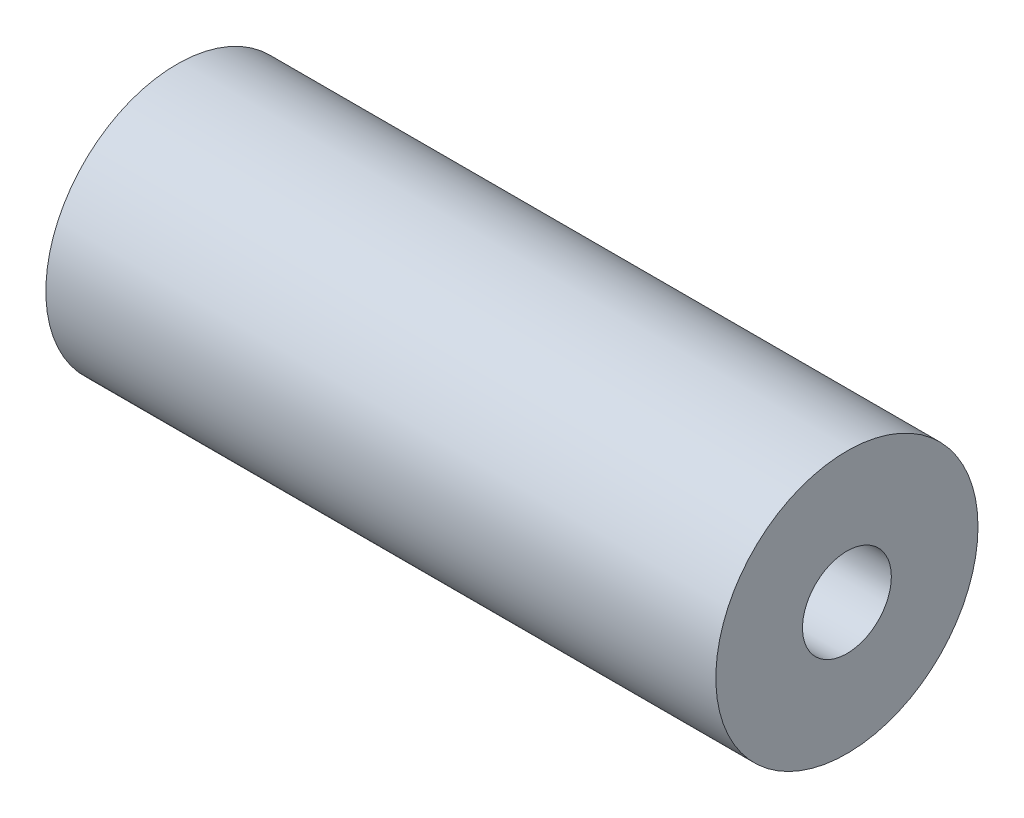
ISO-10303-21;
HEADER;
FILE_DESCRIPTION(('STEP AP214'),'2;1');
FILE_NAME('part.step','',(''),(''),'','','');
FILE_SCHEMA(('AUTOMOTIVE_DESIGN { 1 0 10303 214 1 1 1 1 }'));
ENDSEC;
DATA;
#1=APPLICATION_CONTEXT('core data for automotive mechanical design processes');
#2=APPLICATION_PROTOCOL_DEFINITION('international standard','automotive_design',2000,#1);
#3=PRODUCT_CONTEXT('',#1,'mechanical');
#4=PRODUCT('Part','Part','',(#3));
#5=PRODUCT_RELATED_PRODUCT_CATEGORY('part','',(#4));
#6=PRODUCT_DEFINITION_FORMATION('','',#4);
#7=PRODUCT_DEFINITION_CONTEXT('part definition',#1,'design');
#8=PRODUCT_DEFINITION('design','',#6,#7);
#9=PRODUCT_DEFINITION_SHAPE('','',#8);
#10=(LENGTH_UNIT() NAMED_UNIT(*) SI_UNIT(.MILLI.,.METRE.));
#11=(NAMED_UNIT(*) PLANE_ANGLE_UNIT() SI_UNIT($,.RADIAN.));
#12=(NAMED_UNIT(*) SI_UNIT($,.STERADIAN.) SOLID_ANGLE_UNIT());
#13=UNCERTAINTY_MEASURE_WITH_UNIT(LENGTH_MEASURE(1.E-05),#10,'distance_accuracy_value','');
#14=(GEOMETRIC_REPRESENTATION_CONTEXT(3) GLOBAL_UNCERTAINTY_ASSIGNED_CONTEXT((#13)) GLOBAL_UNIT_ASSIGNED_CONTEXT((#10,
#11,#12)) REPRESENTATION_CONTEXT('',''));
#15=CARTESIAN_POINT('',(0.,0.,0.));
#16=DIRECTION('',(0.,0.,1.));
#17=DIRECTION('',(1.,0.,0.));
#18=AXIS2_PLACEMENT_3D('',#15,#16,#17);
#19=CARTESIAN_POINT('',(14.,0.,0.));
#20=DIRECTION('',(-1.,0.,0.));
#21=DIRECTION('',(0.,0.,1.));
#22=AXIS2_PLACEMENT_3D('',#19,#20,#21);
#23=CYLINDRICAL_SURFACE('',#22,3.);
#24=CARTESIAN_POINT('',(0.,0.,0.));
#25=DIRECTION('',(1.,0.,0.));
#26=DIRECTION('',(0.,0.,-1.));
#27=AXIS2_PLACEMENT_3D('',#24,#25,#26);
#28=CIRCLE('',#27,3.);
#29=CARTESIAN_POINT('',(0.,-1.6583123951777,2.5));
#30=VERTEX_POINT('',#29);
#31=CARTESIAN_POINT('',(0.,1.6583123951777,2.5));
#32=VERTEX_POINT('',#31);
#33=EDGE_CURVE('E91',#30,#32,#28,.T.);
#34=ORIENTED_EDGE('',*,*,#33,.F.);
#35=DIRECTION('',(-1.,0.,0.));
#36=VECTOR('',#35,1.);
#37=CARTESIAN_POINT('',(14.,-1.6583123951777,2.5));
#38=LINE('',#37,#36);
#39=CARTESIAN_POINT('',(14.,-1.6583123951777,2.5));
#40=VERTEX_POINT('',#39);
#41=EDGE_CURVE('E56',#40,#30,#38,.T.);
#42=ORIENTED_EDGE('',*,*,#41,.F.);
#43=CARTESIAN_POINT('',(14.,0.,0.));
#44=DIRECTION('',(1.,0.,0.));
#45=DIRECTION('',(0.,0.,-1.));
#46=AXIS2_PLACEMENT_3D('',#43,#44,#45);
#47=CIRCLE('',#46,3.);
#48=CARTESIAN_POINT('',(14.,1.6583123951777,2.5));
#49=VERTEX_POINT('',#48);
#50=EDGE_CURVE('E72',#40,#49,#47,.T.);
#51=ORIENTED_EDGE('',*,*,#50,.T.);
#52=DIRECTION('',(-1.,0.,0.));
#53=VECTOR('',#52,1.);
#54=CARTESIAN_POINT('',(14.,1.6583123951777,2.5));
#55=LINE('',#54,#53);
#56=EDGE_CURVE('E74',#49,#32,#55,.T.);
#57=ORIENTED_EDGE('',*,*,#56,.T.);
#58=EDGE_LOOP('',(#34,#42,#51,#57));
#59=FACE_BOUND('',#58,.T.);
#60=ADVANCED_FACE('F47',(#59),#23,.F.);
#61=CARTESIAN_POINT('',(14.,0.,2.5));
#62=DIRECTION('',(0.,0.,1.));
#63=DIRECTION('',(1.,0.,0.));
#64=AXIS2_PLACEMENT_3D('',#61,#62,#63);
#65=PLANE('',#64);
#66=DIRECTION('',(0.,1.,0.));
#67=VECTOR('',#66,1.);
#68=CARTESIAN_POINT('',(0.,0.,2.5));
#69=LINE('',#68,#67);
#70=EDGE_CURVE('E82',#30,#32,#69,.T.);
#71=ORIENTED_EDGE('',*,*,#70,.T.);
#72=ORIENTED_EDGE('',*,*,#56,.F.);
#73=DIRECTION('',(0.,1.,0.));
#74=VECTOR('',#73,1.);
#75=CARTESIAN_POINT('',(14.,0.,2.5));
#76=LINE('',#75,#74);
#77=EDGE_CURVE('E78',#40,#49,#76,.T.);
#78=ORIENTED_EDGE('',*,*,#77,.F.);
#79=ORIENTED_EDGE('',*,*,#41,.T.);
#80=EDGE_LOOP('',(#71,#72,#78,#79));
#81=FACE_BOUND('',#80,.T.);
#82=ADVANCED_FACE('F81',(#81),#65,.F.);
#83=CARTESIAN_POINT('',(14.,0.,0.));
#84=DIRECTION('',(-1.,0.,0.));
#85=DIRECTION('',(0.,0.,1.));
#86=AXIS2_PLACEMENT_3D('',#83,#84,#85);
#87=CYLINDRICAL_SURFACE('',#86,4.5);
#88=CARTESIAN_POINT('',(0.,0.,0.));
#89=DIRECTION('',(1.,0.,0.));
#90=DIRECTION('',(0.,0.,-1.));
#91=AXIS2_PLACEMENT_3D('',#88,#89,#90);
#92=CIRCLE('',#91,4.5);
#93=CARTESIAN_POINT('',(0.,0.,-4.5));
#94=VERTEX_POINT('',#93);
#95=EDGE_CURVE('E79',#94,#94,#92,.T.);
#96=ORIENTED_EDGE('',*,*,#95,.T.);
#97=EDGE_LOOP('',(#96));
#98=FACE_BOUND('',#97,.T.);
#99=CARTESIAN_POINT('',(23.,0.,0.));
#100=DIRECTION('',(1.,0.,0.));
#101=DIRECTION('',(0.,0.,-1.));
#102=AXIS2_PLACEMENT_3D('',#99,#100,#101);
#103=CIRCLE('',#102,4.5);
#104=CARTESIAN_POINT('',(23.,0.,-4.5));
#105=VERTEX_POINT('',#104);
#106=EDGE_CURVE('E94',#105,#105,#103,.T.);
#107=ORIENTED_EDGE('',*,*,#106,.F.);
#108=EDGE_LOOP('',(#107));
#109=FACE_BOUND('',#108,.T.);
#110=ADVANCED_FACE('F102',(#98,#109),#87,.T.);
#111=CARTESIAN_POINT('',(0.,0.,0.));
#112=DIRECTION('',(1.,0.,0.));
#113=DIRECTION('',(0.,0.,-1.));
#114=AXIS2_PLACEMENT_3D('',#111,#112,#113);
#115=PLANE('',#114);
#116=ORIENTED_EDGE('',*,*,#33,.T.);
#117=ORIENTED_EDGE('',*,*,#70,.F.);
#118=EDGE_LOOP('',(#116,#117));
#119=FACE_BOUND('',#118,.T.);
#120=ORIENTED_EDGE('',*,*,#95,.F.);
#121=EDGE_LOOP('',(#120));
#122=FACE_BOUND('',#121,.T.);
#123=ADVANCED_FACE('F105',(#119,#122),#115,.F.);
#124=CARTESIAN_POINT('',(14.,0.,0.));
#125=DIRECTION('',(1.,0.,0.));
#126=DIRECTION('',(0.,0.,-1.));
#127=AXIS2_PLACEMENT_3D('',#124,#125,#126);
#128=PLANE('',#127);
#129=ORIENTED_EDGE('',*,*,#50,.F.);
#130=ORIENTED_EDGE('',*,*,#77,.T.);
#131=EDGE_LOOP('',(#129,#130));
#132=FACE_BOUND('',#131,.T.);
#133=ADVANCED_FACE('F86',(#132),#128,.F.);
#134=CARTESIAN_POINT('',(23.,0.,0.));
#135=DIRECTION('',(-1.,0.,0.));
#136=DIRECTION('',(0.,0.,1.));
#137=AXIS2_PLACEMENT_3D('',#134,#135,#136);
#138=CYLINDRICAL_SURFACE('',#137,1.525);
#139=CARTESIAN_POINT('',(23.,0.,0.));
#140=DIRECTION('',(1.,0.,0.));
#141=DIRECTION('',(0.,0.,-1.));
#142=AXIS2_PLACEMENT_3D('',#139,#140,#141);
#143=CIRCLE('',#142,1.525);
#144=CARTESIAN_POINT('',(23.,0.,-1.525));
#145=VERTEX_POINT('',#144);
#146=EDGE_CURVE('E189',#145,#145,#143,.T.);
#147=ORIENTED_EDGE('',*,*,#146,.T.);
#148=EDGE_LOOP('',(#147));
#149=FACE_BOUND('',#148,.T.);
#150=CARTESIAN_POINT('',(16.,0.,0.));
#151=DIRECTION('',(1.,0.,0.));
#152=DIRECTION('',(0.,0.,-1.));
#153=AXIS2_PLACEMENT_3D('',#150,#151,#152);
#154=CIRCLE('',#153,1.525);
#155=CARTESIAN_POINT('',(16.,0.,-1.525));
#156=VERTEX_POINT('',#155);
#157=EDGE_CURVE('E11',#156,#156,#154,.F.);
#158=ORIENTED_EDGE('',*,*,#157,.T.);
#159=EDGE_LOOP('',(#158));
#160=FACE_BOUND('',#159,.T.);
#161=ADVANCED_FACE('F113',(#149,#160),#138,.F.);
#162=CARTESIAN_POINT('',(23.,0.,0.));
#163=DIRECTION('',(1.,0.,0.));
#164=DIRECTION('',(0.,0.,-1.));
#165=AXIS2_PLACEMENT_3D('',#162,#163,#164);
#166=PLANE('',#165);
#167=ORIENTED_EDGE('',*,*,#146,.F.);
#168=EDGE_LOOP('',(#167));
#169=FACE_BOUND('',#168,.T.);
#170=ORIENTED_EDGE('',*,*,#106,.T.);
#171=EDGE_LOOP('',(#170));
#172=FACE_BOUND('',#171,.T.);
#173=ADVANCED_FACE('F141',(#169,#172),#166,.T.);
#174=CARTESIAN_POINT('',(16.,0.,0.));
#175=DIRECTION('',(1.,0.,0.));
#176=DIRECTION('',(0.,0.,-1.));
#177=AXIS2_PLACEMENT_3D('',#174,#175,#176);
#178=PLANE('',#177);
#179=ORIENTED_EDGE('',*,*,#157,.F.);
#180=EDGE_LOOP('',(#179));
#181=FACE_BOUND('',#180,.T.);
#182=ADVANCED_FACE('F150',(#181),#178,.T.);
#183=CLOSED_SHELL('',(#60,#82,#110,#123,#133,#161,#173,#182));
#184=MANIFOLD_SOLID_BREP('B2',#183);
#185=ADVANCED_BREP_SHAPE_REPRESENTATION('',(#18,#184),#14);
#186=SHAPE_DEFINITION_REPRESENTATION(#9,#185);
ENDSEC;
END-ISO-10303-21;
